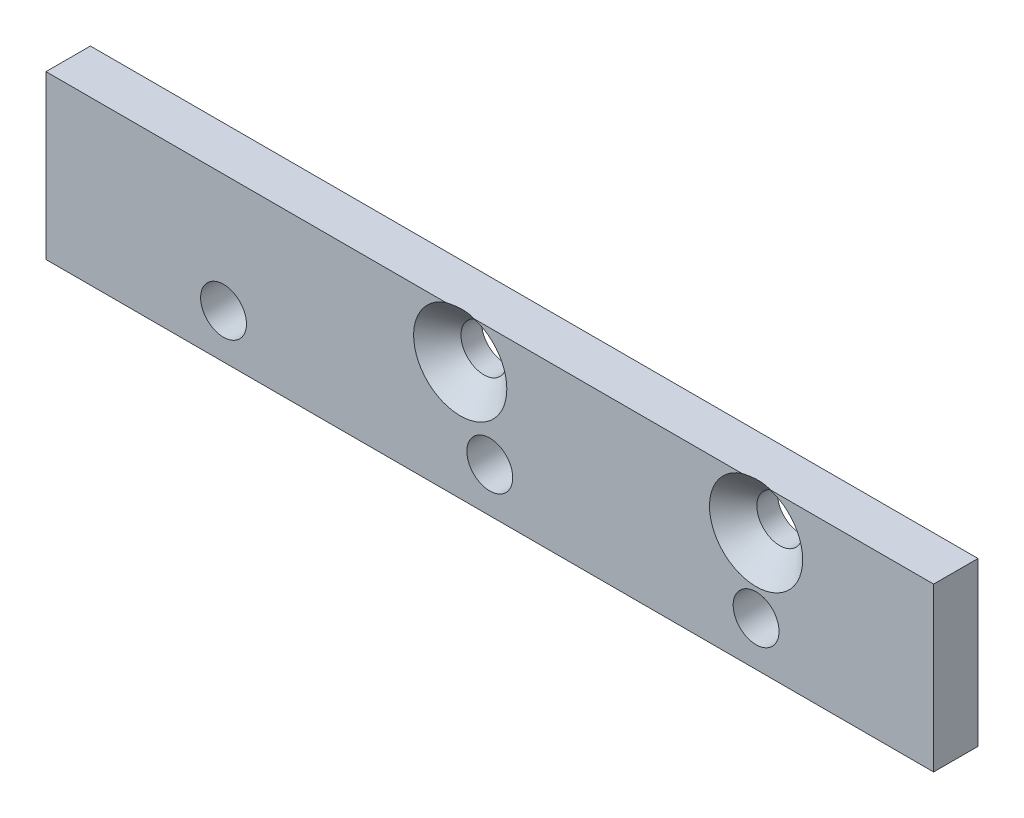
ISO-10303-21;
HEADER;
FILE_DESCRIPTION(('STEP AP214'),'2;1');
FILE_NAME('part.step','',(''),(''),'','','');
FILE_SCHEMA(('AUTOMOTIVE_DESIGN { 1 0 10303 214 1 1 1 1 }'));
ENDSEC;
DATA;
#1=APPLICATION_CONTEXT('core data for automotive mechanical design processes');
#2=APPLICATION_PROTOCOL_DEFINITION('international standard','automotive_design',2000,#1);
#3=PRODUCT_CONTEXT('',#1,'mechanical');
#4=PRODUCT('Part','Part','',(#3));
#5=PRODUCT_RELATED_PRODUCT_CATEGORY('part','',(#4));
#6=PRODUCT_DEFINITION_FORMATION('','',#4);
#7=PRODUCT_DEFINITION_CONTEXT('part definition',#1,'design');
#8=PRODUCT_DEFINITION('design','',#6,#7);
#9=PRODUCT_DEFINITION_SHAPE('','',#8);
#10=(LENGTH_UNIT() NAMED_UNIT(*) SI_UNIT(.MILLI.,.METRE.));
#11=(NAMED_UNIT(*) PLANE_ANGLE_UNIT() SI_UNIT($,.RADIAN.));
#12=(NAMED_UNIT(*) SI_UNIT($,.STERADIAN.) SOLID_ANGLE_UNIT());
#13=UNCERTAINTY_MEASURE_WITH_UNIT(LENGTH_MEASURE(1.E-05),#10,'distance_accuracy_value','');
#14=(GEOMETRIC_REPRESENTATION_CONTEXT(3) GLOBAL_UNCERTAINTY_ASSIGNED_CONTEXT((#13)) GLOBAL_UNIT_ASSIGNED_CONTEXT((#10,
#11,#12)) REPRESENTATION_CONTEXT('',''));
#15=CARTESIAN_POINT('',(0.,0.,0.));
#16=DIRECTION('',(0.,0.,1.));
#17=DIRECTION('',(1.,0.,0.));
#18=AXIS2_PLACEMENT_3D('',#15,#16,#17);
#19=CARTESIAN_POINT('',(0.,0.,3.));
#20=DIRECTION('',(0.,0.,1.));
#21=DIRECTION('',(1.,0.,0.));
#22=AXIS2_PLACEMENT_3D('',#19,#20,#21);
#23=PLANE('',#22);
#24=CARTESIAN_POINT('',(18.,-2.5,3.));
#25=DIRECTION('',(0.,0.,1.));
#26=DIRECTION('',(1.,0.,0.));
#27=AXIS2_PLACEMENT_3D('',#24,#25,#26);
#28=CIRCLE('',#27,1.55);
#29=CARTESIAN_POINT('',(19.55,-2.5,3.));
#30=VERTEX_POINT('',#29);
#31=EDGE_CURVE('E240',#30,#30,#28,.T.);
#32=ORIENTED_EDGE('',*,*,#31,.F.);
#33=EDGE_LOOP('',(#32));
#34=FACE_BOUND('',#33,.T.);
#35=DIRECTION('',(-1.,0.,0.));
#36=VECTOR('',#35,1.);
#37=CARTESIAN_POINT('',(-30.,5.5,3.));
#38=LINE('',#37,#36);
#39=CARTESIAN_POINT('',(30.,5.5,3.));
#40=VERTEX_POINT('',#39);
#41=CARTESIAN_POINT('',(18.960468635615,5.5,3.));
#42=VERTEX_POINT('',#41);
#43=EDGE_CURVE('E96',#40,#42,#38,.T.);
#44=ORIENTED_EDGE('',*,*,#43,.T.);
#45=CARTESIAN_POINT('',(18.,2.5,3.));
#46=DIRECTION('',(0.,0.,1.));
#47=DIRECTION('',(1.,0.,0.));
#48=AXIS2_PLACEMENT_3D('',#45,#46,#47);
#49=CIRCLE('',#48,3.15000000000001);
#50=CARTESIAN_POINT('',(17.039531364385,5.5,3.));
#51=VERTEX_POINT('',#50);
#52=EDGE_CURVE('E140',#42,#51,#49,.F.);
#53=ORIENTED_EDGE('',*,*,#52,.T.);
#54=CARTESIAN_POINT('',(-1.03953136438505,5.5,3.));
#55=VERTEX_POINT('',#54);
#56=EDGE_CURVE('E107',#51,#55,#38,.T.);
#57=ORIENTED_EDGE('',*,*,#56,.T.);
#58=CARTESIAN_POINT('',(-2.,2.5,3.));
#59=DIRECTION('',(0.,0.,1.));
#60=DIRECTION('',(1.,0.,0.));
#61=AXIS2_PLACEMENT_3D('',#58,#59,#60);
#62=CIRCLE('',#61,3.15000000000001);
#63=CARTESIAN_POINT('',(-2.96046863561495,5.5,3.));
#64=VERTEX_POINT('',#63);
#65=EDGE_CURVE('E131',#55,#64,#62,.F.);
#66=ORIENTED_EDGE('',*,*,#65,.T.);
#67=CARTESIAN_POINT('',(-30.,5.5,3.));
#68=VERTEX_POINT('',#67);
#69=EDGE_CURVE('E109',#64,#68,#38,.T.);
#70=ORIENTED_EDGE('',*,*,#69,.T.);
#71=DIRECTION('',(0.,-1.,0.));
#72=VECTOR('',#71,1.);
#73=CARTESIAN_POINT('',(-30.,5.5,3.));
#74=LINE('',#73,#72);
#75=CARTESIAN_POINT('',(-30.,-5.5,3.));
#76=VERTEX_POINT('',#75);
#77=EDGE_CURVE('E106',#68,#76,#74,.T.);
#78=ORIENTED_EDGE('',*,*,#77,.T.);
#79=DIRECTION('',(1.,0.,0.));
#80=VECTOR('',#79,1.);
#81=CARTESIAN_POINT('',(-30.,-5.5,3.));
#82=LINE('',#81,#80);
#83=CARTESIAN_POINT('',(30.,-5.5,3.));
#84=VERTEX_POINT('',#83);
#85=EDGE_CURVE('E114',#76,#84,#82,.T.);
#86=ORIENTED_EDGE('',*,*,#85,.T.);
#87=DIRECTION('',(0.,1.,0.));
#88=VECTOR('',#87,1.);
#89=CARTESIAN_POINT('',(30.,5.5,3.));
#90=LINE('',#89,#88);
#91=EDGE_CURVE('E111',#84,#40,#90,.T.);
#92=ORIENTED_EDGE('',*,*,#91,.T.);
#93=EDGE_LOOP('',(#44,#53,#57,#66,#70,#78,#86,#92));
#94=FACE_BOUND('',#93,.T.);
#95=CARTESIAN_POINT('',(0.,-2.5,3.));
#96=DIRECTION('',(0.,0.,1.));
#97=DIRECTION('',(1.,0.,0.));
#98=AXIS2_PLACEMENT_3D('',#95,#96,#97);
#99=CIRCLE('',#98,1.55);
#100=CARTESIAN_POINT('',(1.54999999999999,-2.5,3.));
#101=VERTEX_POINT('',#100);
#102=EDGE_CURVE('E235',#101,#101,#99,.T.);
#103=ORIENTED_EDGE('',*,*,#102,.F.);
#104=EDGE_LOOP('',(#103));
#105=FACE_BOUND('',#104,.T.);
#106=CARTESIAN_POINT('',(-18.,-2.5,3.));
#107=DIRECTION('',(0.,0.,1.));
#108=DIRECTION('',(1.,0.,0.));
#109=AXIS2_PLACEMENT_3D('',#106,#107,#108);
#110=CIRCLE('',#109,1.55);
#111=CARTESIAN_POINT('',(-16.45,-2.5,3.));
#112=VERTEX_POINT('',#111);
#113=EDGE_CURVE('E248',#112,#112,#110,.T.);
#114=ORIENTED_EDGE('',*,*,#113,.F.);
#115=EDGE_LOOP('',(#114));
#116=FACE_BOUND('',#115,.T.);
#117=ADVANCED_FACE('F41',(#34,#94,#105,#116),#23,.T.);
#118=CARTESIAN_POINT('',(0.,0.,0.));
#119=DIRECTION('',(0.,0.,1.));
#120=DIRECTION('',(1.,0.,0.));
#121=AXIS2_PLACEMENT_3D('',#118,#119,#120);
#122=PLANE('',#121);
#123=DIRECTION('',(0.,1.,0.));
#124=VECTOR('',#123,1.);
#125=CARTESIAN_POINT('',(30.,5.5,0.));
#126=LINE('',#125,#124);
#127=CARTESIAN_POINT('',(30.,-5.5,0.));
#128=VERTEX_POINT('',#127);
#129=CARTESIAN_POINT('',(30.,5.5,0.));
#130=VERTEX_POINT('',#129);
#131=EDGE_CURVE('E123',#128,#130,#126,.T.);
#132=ORIENTED_EDGE('',*,*,#131,.F.);
#133=DIRECTION('',(1.,0.,0.));
#134=VECTOR('',#133,1.);
#135=CARTESIAN_POINT('',(-30.,-5.5,0.));
#136=LINE('',#135,#134);
#137=CARTESIAN_POINT('',(-30.,-5.5,0.));
#138=VERTEX_POINT('',#137);
#139=EDGE_CURVE('E119',#138,#128,#136,.T.);
#140=ORIENTED_EDGE('',*,*,#139,.F.);
#141=DIRECTION('',(0.,-1.,0.));
#142=VECTOR('',#141,1.);
#143=CARTESIAN_POINT('',(-30.,5.5,0.));
#144=LINE('',#143,#142);
#145=CARTESIAN_POINT('',(-30.,5.5,0.));
#146=VERTEX_POINT('',#145);
#147=EDGE_CURVE('E206',#146,#138,#144,.T.);
#148=ORIENTED_EDGE('',*,*,#147,.F.);
#149=DIRECTION('',(-1.,0.,0.));
#150=VECTOR('',#149,1.);
#151=CARTESIAN_POINT('',(-30.,5.5,0.));
#152=LINE('',#151,#150);
#153=EDGE_CURVE('E211',#130,#146,#152,.T.);
#154=ORIENTED_EDGE('',*,*,#153,.F.);
#155=EDGE_LOOP('',(#132,#140,#148,#154));
#156=FACE_BOUND('',#155,.T.);
#157=CARTESIAN_POINT('',(18.,2.5,0.));
#158=DIRECTION('',(0.,0.,1.));
#159=DIRECTION('',(1.,0.,0.));
#160=AXIS2_PLACEMENT_3D('',#157,#158,#159);
#161=CIRCLE('',#160,1.55);
#162=CARTESIAN_POINT('',(19.55,2.5,0.));
#163=VERTEX_POINT('',#162);
#164=EDGE_CURVE('E213',#163,#163,#161,.T.);
#165=ORIENTED_EDGE('',*,*,#164,.T.);
#166=EDGE_LOOP('',(#165));
#167=FACE_BOUND('',#166,.T.);
#168=CARTESIAN_POINT('',(-2.,2.5,0.));
#169=DIRECTION('',(0.,0.,1.));
#170=DIRECTION('',(1.,0.,0.));
#171=AXIS2_PLACEMENT_3D('',#168,#169,#170);
#172=CIRCLE('',#171,1.55);
#173=CARTESIAN_POINT('',(-0.449999999999998,2.5,0.));
#174=VERTEX_POINT('',#173);
#175=EDGE_CURVE('E219',#174,#174,#172,.T.);
#176=ORIENTED_EDGE('',*,*,#175,.T.);
#177=EDGE_LOOP('',(#176));
#178=FACE_BOUND('',#177,.T.);
#179=CARTESIAN_POINT('',(0.,-2.5,0.));
#180=DIRECTION('',(0.,0.,1.));
#181=DIRECTION('',(1.,0.,0.));
#182=AXIS2_PLACEMENT_3D('',#179,#180,#181);
#183=CIRCLE('',#182,1.55);
#184=CARTESIAN_POINT('',(1.54999999999999,-2.5,0.));
#185=VERTEX_POINT('',#184);
#186=EDGE_CURVE('E236',#185,#185,#183,.T.);
#187=ORIENTED_EDGE('',*,*,#186,.T.);
#188=EDGE_LOOP('',(#187));
#189=FACE_BOUND('',#188,.T.);
#190=CARTESIAN_POINT('',(18.,-2.5,0.));
#191=DIRECTION('',(0.,0.,1.));
#192=DIRECTION('',(1.,0.,0.));
#193=AXIS2_PLACEMENT_3D('',#190,#191,#192);
#194=CIRCLE('',#193,1.55);
#195=CARTESIAN_POINT('',(19.55,-2.5,0.));
#196=VERTEX_POINT('',#195);
#197=EDGE_CURVE('E244',#196,#196,#194,.T.);
#198=ORIENTED_EDGE('',*,*,#197,.T.);
#199=EDGE_LOOP('',(#198));
#200=FACE_BOUND('',#199,.T.);
#201=CARTESIAN_POINT('',(-18.,-2.5,0.));
#202=DIRECTION('',(0.,0.,1.));
#203=DIRECTION('',(1.,0.,0.));
#204=AXIS2_PLACEMENT_3D('',#201,#202,#203);
#205=CIRCLE('',#204,1.55);
#206=CARTESIAN_POINT('',(-16.45,-2.5,0.));
#207=VERTEX_POINT('',#206);
#208=EDGE_CURVE('E252',#207,#207,#205,.T.);
#209=ORIENTED_EDGE('',*,*,#208,.T.);
#210=EDGE_LOOP('',(#209));
#211=FACE_BOUND('',#210,.T.);
#212=ADVANCED_FACE('F161',(#156,#167,#178,#189,#200,#211),#122,.F.);
#213=CARTESIAN_POINT('',(30.,5.5,3.));
#214=DIRECTION('',(-1.,0.,0.));
#215=DIRECTION('',(0.,-1.,0.));
#216=AXIS2_PLACEMENT_3D('',#213,#214,#215);
#217=PLANE('',#216);
#218=ORIENTED_EDGE('',*,*,#131,.T.);
#219=DIRECTION('',(0.,0.,-1.));
#220=VECTOR('',#219,1.);
#221=CARTESIAN_POINT('',(30.,5.5,3.));
#222=LINE('',#221,#220);
#223=EDGE_CURVE('E100',#40,#130,#222,.T.);
#224=ORIENTED_EDGE('',*,*,#223,.F.);
#225=ORIENTED_EDGE('',*,*,#91,.F.);
#226=DIRECTION('',(0.,0.,-1.));
#227=VECTOR('',#226,1.);
#228=CARTESIAN_POINT('',(30.,-5.5,3.));
#229=LINE('',#228,#227);
#230=EDGE_CURVE('E202',#84,#128,#229,.T.);
#231=ORIENTED_EDGE('',*,*,#230,.T.);
#232=EDGE_LOOP('',(#218,#224,#225,#231));
#233=FACE_BOUND('',#232,.T.);
#234=ADVANCED_FACE('F121',(#233),#217,.F.);
#235=CARTESIAN_POINT('',(-30.,5.5,3.));
#236=DIRECTION('',(0.,-1.,0.));
#237=DIRECTION('',(0.,0.,-1.));
#238=AXIS2_PLACEMENT_3D('',#235,#236,#237);
#239=PLANE('',#238);
#240=ORIENTED_EDGE('',*,*,#56,.F.);
#241=CARTESIAN_POINT('',(17.039531364385,5.5,3.));
#242=CARTESIAN_POINT('',(17.1147667895656,5.5,2.97704177687978));
#243=CARTESIAN_POINT('',(17.1907292677571,5.5,2.95634124979348));
#244=CARTESIAN_POINT('',(17.3439320457736,5.5,2.92000212766423));
#245=CARTESIAN_POINT('',(17.421173572901,5.5,2.90436873076703));
#246=CARTESIAN_POINT('',(17.5748506448356,5.5,2.87904844721265));
#247=CARTESIAN_POINT('',(17.6512650824637,5.5,2.86923540742403));
#248=CARTESIAN_POINT('',(17.8045820910393,5.5,2.85538925266814));
#249=CARTESIAN_POINT('',(17.8814844073265,5.5,2.85135333734947));
#250=CARTESIAN_POINT('',(18.0421337871383,5.5,2.84912908689681));
#251=CARTESIAN_POINT('',(18.1258889901947,5.5,2.85148528312724));
#252=CARTESIAN_POINT('',(18.2929644022777,5.5,2.86311679459818));
#253=CARTESIAN_POINT('',(18.3762842990525,5.5,2.87239653136345));
#254=CARTESIAN_POINT('',(18.5439994570599,5.5,2.89776971901784));
#255=CARTESIAN_POINT('',(18.6283693023475,5.5,2.91402817448396));
#256=CARTESIAN_POINT('',(18.7956060543293,5.5,2.95263266430234));
#257=CARTESIAN_POINT('',(18.8784746377675,5.5,2.97497139506176));
#258=CARTESIAN_POINT('',(18.960468635615,5.5,3.));
#259=B_SPLINE_CURVE_WITH_KNOTS('',3,(#241,#242,#243,#244,#245,#246,#247,#248,#249,#250,#251,
#252,#253,#254,#255,#256,#257,#258),.UNSPECIFIED.,.F.,.F.,(4,2,2,2,2,2,2,2,4),(0.,
0.236000583711203,0.472242509353801,0.703156776316468,0.933959074024978,1.18502586975385,
1.43625313963098,1.69377935481524,1.95099758579081),.UNSPECIFIED.);
#260=EDGE_CURVE('E52',#51,#42,#259,.T.);
#261=ORIENTED_EDGE('',*,*,#260,.T.);
#262=ORIENTED_EDGE('',*,*,#43,.F.);
#263=ORIENTED_EDGE('',*,*,#223,.T.);
#264=ORIENTED_EDGE('',*,*,#153,.T.);
#265=DIRECTION('',(0.,0.,-1.));
#266=VECTOR('',#265,1.);
#267=CARTESIAN_POINT('',(-30.,5.5,3.));
#268=LINE('',#267,#266);
#269=EDGE_CURVE('E126',#68,#146,#268,.T.);
#270=ORIENTED_EDGE('',*,*,#269,.F.);
#271=ORIENTED_EDGE('',*,*,#69,.F.);
#272=CARTESIAN_POINT('',(-2.96046863561495,5.5,3.));
#273=CARTESIAN_POINT('',(-2.88523321043438,5.5,2.97704177687978));
#274=CARTESIAN_POINT('',(-2.8092707322429,5.5,2.95634124979348));
#275=CARTESIAN_POINT('',(-2.65606795422641,5.5,2.92000212766423));
#276=CARTESIAN_POINT('',(-2.578826427099,5.5,2.90436873076703));
#277=CARTESIAN_POINT('',(-2.42514935516438,5.5,2.87904844721265));
#278=CARTESIAN_POINT('',(-2.34873491753632,5.5,2.86923540742403));
#279=CARTESIAN_POINT('',(-2.19541790896068,5.5,2.85538925266814));
#280=CARTESIAN_POINT('',(-2.1185155926735,5.5,2.85135333734948));
#281=CARTESIAN_POINT('',(-1.95786621286165,5.5,2.84912908689682));
#282=CARTESIAN_POINT('',(-1.8741110098053,5.5,2.85148528312724));
#283=CARTESIAN_POINT('',(-1.7070355977223,5.5,2.86311679459818));
#284=CARTESIAN_POINT('',(-1.62371570094753,5.5,2.87239653136346));
#285=CARTESIAN_POINT('',(-1.45600054294013,5.5,2.89776971901784));
#286=CARTESIAN_POINT('',(-1.37163069765254,5.5,2.91402817448396));
#287=CARTESIAN_POINT('',(-1.20439394567074,5.5,2.95263266430234));
#288=CARTESIAN_POINT('',(-1.12152536223255,5.5,2.97497139506176));
#289=CARTESIAN_POINT('',(-1.03953136438505,5.5,3.));
#290=B_SPLINE_CURVE_WITH_KNOTS('',3,(#272,#273,#274,#275,#276,#277,#278,#279,#280,#281,#282,
#283,#284,#285,#286,#287,#288,#289),.UNSPECIFIED.,.F.,.F.,(4,2,2,2,2,2,2,2,4),(0.,
0.236000583711202,0.472242509353798,0.703156776316465,0.933959074024976,1.18502586975384,
1.43625313963096,1.69377935481522,1.95099758579078),.UNSPECIFIED.);
#291=EDGE_CURVE('E58',#64,#55,#290,.T.);
#292=ORIENTED_EDGE('',*,*,#291,.T.);
#293=EDGE_LOOP('',(#240,#261,#262,#263,#264,#270,#271,#292));
#294=FACE_BOUND('',#293,.T.);
#295=ADVANCED_FACE('F98',(#294),#239,.F.);
#296=CARTESIAN_POINT('',(-30.,5.5,3.));
#297=DIRECTION('',(1.,0.,0.));
#298=DIRECTION('',(0.,0.,-1.));
#299=AXIS2_PLACEMENT_3D('',#296,#297,#298);
#300=PLANE('',#299);
#301=ORIENTED_EDGE('',*,*,#147,.T.);
#302=DIRECTION('',(0.,0.,-1.));
#303=VECTOR('',#302,1.);
#304=CARTESIAN_POINT('',(-30.,-5.5,3.));
#305=LINE('',#304,#303);
#306=EDGE_CURVE('E134',#76,#138,#305,.T.);
#307=ORIENTED_EDGE('',*,*,#306,.F.);
#308=ORIENTED_EDGE('',*,*,#77,.F.);
#309=ORIENTED_EDGE('',*,*,#269,.T.);
#310=EDGE_LOOP('',(#301,#307,#308,#309));
#311=FACE_BOUND('',#310,.T.);
#312=ADVANCED_FACE('F157',(#311),#300,.F.);
#313=CARTESIAN_POINT('',(-30.,-5.5,3.));
#314=DIRECTION('',(0.,1.,0.));
#315=DIRECTION('',(0.,0.,1.));
#316=AXIS2_PLACEMENT_3D('',#313,#314,#315);
#317=PLANE('',#316);
#318=ORIENTED_EDGE('',*,*,#139,.T.);
#319=ORIENTED_EDGE('',*,*,#230,.F.);
#320=ORIENTED_EDGE('',*,*,#85,.F.);
#321=ORIENTED_EDGE('',*,*,#306,.T.);
#322=EDGE_LOOP('',(#318,#319,#320,#321));
#323=FACE_BOUND('',#322,.T.);
#324=ADVANCED_FACE('F190',(#323),#317,.F.);
#325=CARTESIAN_POINT('',(18.,2.5,3.));
#326=DIRECTION('',(0.,0.,-1.));
#327=DIRECTION('',(-1.,0.,0.));
#328=AXIS2_PLACEMENT_3D('',#325,#326,#327);
#329=CYLINDRICAL_SURFACE('',#328,1.55);
#330=CARTESIAN_POINT('',(18.,2.5,1.4));
#331=DIRECTION('',(0.,0.,1.));
#332=DIRECTION('',(1.,0.,0.));
#333=AXIS2_PLACEMENT_3D('',#330,#331,#332);
#334=CIRCLE('',#333,1.55);
#335=CARTESIAN_POINT('',(19.55,2.5,1.4));
#336=VERTEX_POINT('',#335);
#337=EDGE_CURVE('E125',#336,#336,#334,.T.);
#338=ORIENTED_EDGE('',*,*,#337,.T.);
#339=EDGE_LOOP('',(#338));
#340=FACE_BOUND('',#339,.T.);
#341=ORIENTED_EDGE('',*,*,#164,.F.);
#342=EDGE_LOOP('',(#341));
#343=FACE_BOUND('',#342,.T.);
#344=ADVANCED_FACE('F188',(#340,#343),#329,.F.);
#345=CARTESIAN_POINT('',(-2.,2.5,3.));
#346=DIRECTION('',(0.,0.,-1.));
#347=DIRECTION('',(-1.,0.,0.));
#348=AXIS2_PLACEMENT_3D('',#345,#346,#347);
#349=CYLINDRICAL_SURFACE('',#348,1.55);
#350=CARTESIAN_POINT('',(-2.,2.5,1.4));
#351=DIRECTION('',(0.,0.,1.));
#352=DIRECTION('',(1.,0.,0.));
#353=AXIS2_PLACEMENT_3D('',#350,#351,#352);
#354=CIRCLE('',#353,1.55);
#355=CARTESIAN_POINT('',(-0.449999999999998,2.5,1.4));
#356=VERTEX_POINT('',#355);
#357=EDGE_CURVE('E11',#356,#356,#354,.T.);
#358=ORIENTED_EDGE('',*,*,#357,.T.);
#359=EDGE_LOOP('',(#358));
#360=FACE_BOUND('',#359,.T.);
#361=ORIENTED_EDGE('',*,*,#175,.F.);
#362=EDGE_LOOP('',(#361));
#363=FACE_BOUND('',#362,.T.);
#364=ADVANCED_FACE('F197',(#360,#363),#349,.F.);
#365=CARTESIAN_POINT('',(0.,-2.5,3.));
#366=DIRECTION('',(0.,0.,-1.));
#367=DIRECTION('',(-1.,0.,0.));
#368=AXIS2_PLACEMENT_3D('',#365,#366,#367);
#369=CYLINDRICAL_SURFACE('',#368,1.55);
#370=ORIENTED_EDGE('',*,*,#102,.T.);
#371=EDGE_LOOP('',(#370));
#372=FACE_BOUND('',#371,.T.);
#373=ORIENTED_EDGE('',*,*,#186,.F.);
#374=EDGE_LOOP('',(#373));
#375=FACE_BOUND('',#374,.T.);
#376=ADVANCED_FACE('F266',(#372,#375),#369,.F.);
#377=CARTESIAN_POINT('',(18.,-2.5,3.));
#378=DIRECTION('',(0.,0.,-1.));
#379=DIRECTION('',(-1.,0.,0.));
#380=AXIS2_PLACEMENT_3D('',#377,#378,#379);
#381=CYLINDRICAL_SURFACE('',#380,1.55);
#382=ORIENTED_EDGE('',*,*,#31,.T.);
#383=EDGE_LOOP('',(#382));
#384=FACE_BOUND('',#383,.T.);
#385=ORIENTED_EDGE('',*,*,#197,.F.);
#386=EDGE_LOOP('',(#385));
#387=FACE_BOUND('',#386,.T.);
#388=ADVANCED_FACE('F174',(#384,#387),#381,.F.);
#389=CARTESIAN_POINT('',(-18.,-2.5,3.));
#390=DIRECTION('',(0.,0.,-1.));
#391=DIRECTION('',(-1.,0.,0.));
#392=AXIS2_PLACEMENT_3D('',#389,#390,#391);
#393=CYLINDRICAL_SURFACE('',#392,1.55);
#394=ORIENTED_EDGE('',*,*,#113,.T.);
#395=EDGE_LOOP('',(#394));
#396=FACE_BOUND('',#395,.T.);
#397=ORIENTED_EDGE('',*,*,#208,.F.);
#398=EDGE_LOOP('',(#397));
#399=FACE_BOUND('',#398,.T.);
#400=ADVANCED_FACE('F168',(#396,#399),#393,.F.);
#401=CARTESIAN_POINT('',(18.,2.5,1.4));
#402=DIRECTION('',(0.,0.,1.));
#403=DIRECTION('',(1.,0.,0.));
#404=AXIS2_PLACEMENT_3D('',#401,#402,#403);
#405=CONICAL_SURFACE('',#404,1.55,0.785398163397451);
#406=ORIENTED_EDGE('',*,*,#260,.F.);
#407=ORIENTED_EDGE('',*,*,#52,.F.);
#408=EDGE_LOOP('',(#406,#407));
#409=FACE_BOUND('',#408,.T.);
#410=ORIENTED_EDGE('',*,*,#337,.F.);
#411=EDGE_LOOP('',(#410));
#412=FACE_BOUND('',#411,.T.);
#413=ADVANCED_FACE('F163',(#409,#412),#405,.F.);
#414=CARTESIAN_POINT('',(-2.,2.5,1.4));
#415=DIRECTION('',(0.,0.,1.));
#416=DIRECTION('',(1.,0.,0.));
#417=AXIS2_PLACEMENT_3D('',#414,#415,#416);
#418=CONICAL_SURFACE('',#417,1.55,0.785398163397451);
#419=ORIENTED_EDGE('',*,*,#291,.F.);
#420=ORIENTED_EDGE('',*,*,#65,.F.);
#421=EDGE_LOOP('',(#419,#420));
#422=FACE_BOUND('',#421,.T.);
#423=ORIENTED_EDGE('',*,*,#357,.F.);
#424=EDGE_LOOP('',(#423));
#425=FACE_BOUND('',#424,.T.);
#426=ADVANCED_FACE('F44',(#422,#425),#418,.F.);
#427=CLOSED_SHELL('',(#117,#212,#234,#295,#312,#324,#344,#364,#376,#388,#400,#413,#426));
#428=MANIFOLD_SOLID_BREP('B2',#427);
#429=ADVANCED_BREP_SHAPE_REPRESENTATION('',(#18,#428),#14);
#430=SHAPE_DEFINITION_REPRESENTATION(#9,#429);
ENDSEC;
END-ISO-10303-21;
